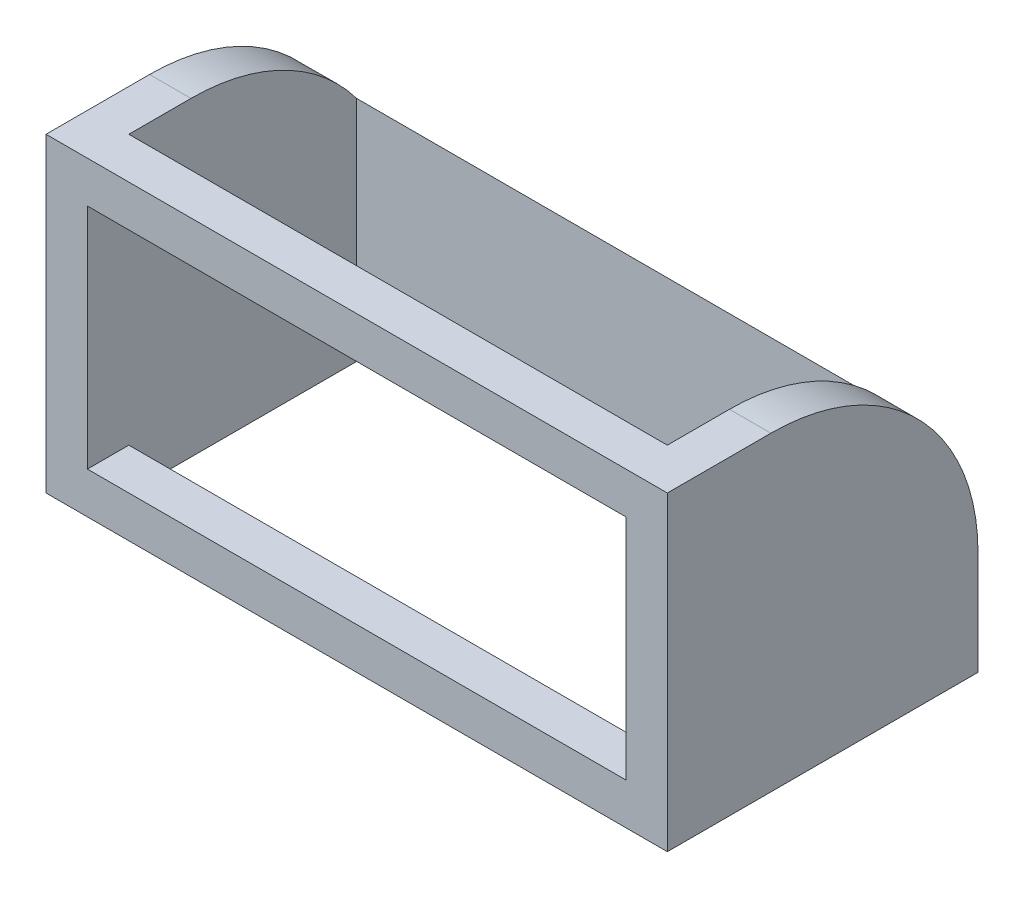
ISO-10303-21;
HEADER;
FILE_DESCRIPTION(('STEP AP214'),'2;1');
FILE_NAME('part.step','',(''),(''),'','','');
FILE_SCHEMA(('AUTOMOTIVE_DESIGN { 1 0 10303 214 1 1 1 1 }'));
ENDSEC;
DATA;
#1=APPLICATION_CONTEXT('core data for automotive mechanical design processes');
#2=APPLICATION_PROTOCOL_DEFINITION('international standard','automotive_design',2000,#1);
#3=PRODUCT_CONTEXT('',#1,'mechanical');
#4=PRODUCT('Part','Part','',(#3));
#5=PRODUCT_RELATED_PRODUCT_CATEGORY('part','',(#4));
#6=PRODUCT_DEFINITION_FORMATION('','',#4);
#7=PRODUCT_DEFINITION_CONTEXT('part definition',#1,'design');
#8=PRODUCT_DEFINITION('design','',#6,#7);
#9=PRODUCT_DEFINITION_SHAPE('','',#8);
#10=(LENGTH_UNIT() NAMED_UNIT(*) SI_UNIT(.MILLI.,.METRE.));
#11=(NAMED_UNIT(*) PLANE_ANGLE_UNIT() SI_UNIT($,.RADIAN.));
#12=(NAMED_UNIT(*) SI_UNIT($,.STERADIAN.) SOLID_ANGLE_UNIT());
#13=UNCERTAINTY_MEASURE_WITH_UNIT(LENGTH_MEASURE(1.E-05),#10,'distance_accuracy_value','');
#14=(GEOMETRIC_REPRESENTATION_CONTEXT(3) GLOBAL_UNCERTAINTY_ASSIGNED_CONTEXT((#13)) GLOBAL_UNIT_ASSIGNED_CONTEXT((#10,
#11,#12)) REPRESENTATION_CONTEXT('',''));
#15=CARTESIAN_POINT('',(0.,0.,0.));
#16=DIRECTION('',(0.,0.,1.));
#17=DIRECTION('',(1.,0.,0.));
#18=AXIS2_PLACEMENT_3D('',#15,#16,#17);
#19=CARTESIAN_POINT('',(13.,15.,5.5));
#20=DIRECTION('',(0.,0.,1.));
#21=DIRECTION('',(1.,0.,0.));
#22=AXIS2_PLACEMENT_3D('',#19,#20,#21);
#23=PLANE('',#22);
#24=DIRECTION('',(0.,-1.,0.));
#25=VECTOR('',#24,1.);
#26=CARTESIAN_POINT('',(13.,15.,5.5));
#27=LINE('',#26,#25);
#28=CARTESIAN_POINT('',(13.,15.,5.5));
#29=VERTEX_POINT('',#28);
#30=CARTESIAN_POINT('',(13.,13.,5.5));
#31=VERTEX_POINT('',#30);
#32=EDGE_CURVE('E202',#29,#31,#27,.T.);
#33=ORIENTED_EDGE('',*,*,#32,.T.);
#34=DIRECTION('',(-1.,0.,0.));
#35=VECTOR('',#34,1.);
#36=CARTESIAN_POINT('',(13.,13.,5.5));
#37=LINE('',#36,#35);
#38=CARTESIAN_POINT('',(-13.,13.,5.5));
#39=VERTEX_POINT('',#38);
#40=EDGE_CURVE('E11',#31,#39,#37,.T.);
#41=ORIENTED_EDGE('',*,*,#40,.T.);
#42=DIRECTION('',(0.,-1.,0.));
#43=VECTOR('',#42,1.);
#44=CARTESIAN_POINT('',(-13.,15.,5.49999999999999));
#45=LINE('',#44,#43);
#46=CARTESIAN_POINT('',(-13.,15.,5.49999999999999));
#47=VERTEX_POINT('',#46);
#48=EDGE_CURVE('E197',#47,#39,#45,.T.);
#49=ORIENTED_EDGE('',*,*,#48,.F.);
#50=DIRECTION('',(-1.,0.,0.));
#51=VECTOR('',#50,1.);
#52=CARTESIAN_POINT('',(13.,15.,5.5));
#53=LINE('',#52,#51);
#54=EDGE_CURVE('E180',#29,#47,#53,.T.);
#55=ORIENTED_EDGE('',*,*,#54,.F.);
#56=EDGE_LOOP('',(#33,#41,#49,#55));
#57=FACE_BOUND('',#56,.T.);
#58=ADVANCED_FACE('F39',(#57),#23,.F.);
#59=CARTESIAN_POINT('',(15.,15.,7.5));
#60=DIRECTION('',(-1.,0.,0.));
#61=DIRECTION('',(0.,0.,1.));
#62=AXIS2_PLACEMENT_3D('',#59,#60,#61);
#63=PLANE('',#62);
#64=DIRECTION('',(0.,-1.,0.));
#65=VECTOR('',#64,1.);
#66=CARTESIAN_POINT('',(15.,15.,-7.5));
#67=LINE('',#66,#65);
#68=CARTESIAN_POINT('',(15.,5.,-7.5));
#69=VERTEX_POINT('',#68);
#70=CARTESIAN_POINT('',(15.,0.,-7.5));
#71=VERTEX_POINT('',#70);
#72=EDGE_CURVE('E249',#69,#71,#67,.T.);
#73=ORIENTED_EDGE('',*,*,#72,.F.);
#74=CARTESIAN_POINT('',(15.,5.,2.5));
#75=DIRECTION('',(-1.,0.,0.));
#76=DIRECTION('',(0.,0.,1.));
#77=AXIS2_PLACEMENT_3D('',#74,#75,#76);
#78=CIRCLE('',#77,10.);
#79=CARTESIAN_POINT('',(15.,15.,2.5));
#80=VERTEX_POINT('',#79);
#81=EDGE_CURVE('E263',#69,#80,#78,.F.);
#82=ORIENTED_EDGE('',*,*,#81,.T.);
#83=DIRECTION('',(0.,0.,-1.));
#84=VECTOR('',#83,1.);
#85=CARTESIAN_POINT('',(15.,15.,7.5));
#86=LINE('',#85,#84);
#87=CARTESIAN_POINT('',(15.,15.,7.5));
#88=VERTEX_POINT('',#87);
#89=EDGE_CURVE('E215',#88,#80,#86,.T.);
#90=ORIENTED_EDGE('',*,*,#89,.F.);
#91=DIRECTION('',(0.,-1.,0.));
#92=VECTOR('',#91,1.);
#93=CARTESIAN_POINT('',(15.,15.,7.5));
#94=LINE('',#93,#92);
#95=CARTESIAN_POINT('',(15.,0.,7.5));
#96=VERTEX_POINT('',#95);
#97=EDGE_CURVE('E226',#88,#96,#94,.T.);
#98=ORIENTED_EDGE('',*,*,#97,.T.);
#99=DIRECTION('',(0.,0.,-1.));
#100=VECTOR('',#99,1.);
#101=CARTESIAN_POINT('',(15.,0.,7.5));
#102=LINE('',#101,#100);
#103=EDGE_CURVE('E214',#96,#71,#102,.T.);
#104=ORIENTED_EDGE('',*,*,#103,.T.);
#105=EDGE_LOOP('',(#73,#82,#90,#98,#104));
#106=FACE_BOUND('',#105,.T.);
#107=ADVANCED_FACE('F308',(#106),#63,.F.);
#108=CARTESIAN_POINT('',(-15.,15.,-7.5));
#109=DIRECTION('',(0.,0.,1.));
#110=DIRECTION('',(1.,0.,0.));
#111=AXIS2_PLACEMENT_3D('',#108,#109,#110);
#112=PLANE('',#111);
#113=DIRECTION('',(0.,-1.,0.));
#114=VECTOR('',#113,1.);
#115=CARTESIAN_POINT('',(-15.,15.,-7.5));
#116=LINE('',#115,#114);
#117=CARTESIAN_POINT('',(-15.,5.,-7.5));
#118=VERTEX_POINT('',#117);
#119=CARTESIAN_POINT('',(-15.,0.,-7.5));
#120=VERTEX_POINT('',#119);
#121=EDGE_CURVE('E246',#118,#120,#116,.T.);
#122=ORIENTED_EDGE('',*,*,#121,.F.);
#123=DIRECTION('',(-1.,0.,0.));
#124=VECTOR('',#123,1.);
#125=CARTESIAN_POINT('',(-15.,5.,-7.5));
#126=LINE('',#125,#124);
#127=EDGE_CURVE('E260',#118,#69,#126,.F.);
#128=ORIENTED_EDGE('',*,*,#127,.T.);
#129=ORIENTED_EDGE('',*,*,#72,.T.);
#130=DIRECTION('',(-1.,0.,0.));
#131=VECTOR('',#130,1.);
#132=CARTESIAN_POINT('',(-15.,0.,-7.5));
#133=LINE('',#132,#131);
#134=EDGE_CURVE('E230',#71,#120,#133,.T.);
#135=ORIENTED_EDGE('',*,*,#134,.T.);
#136=EDGE_LOOP('',(#122,#128,#129,#135));
#137=FACE_BOUND('',#136,.T.);
#138=ADVANCED_FACE('F316',(#137),#112,.F.);
#139=CARTESIAN_POINT('',(-15.,15.,7.5));
#140=DIRECTION('',(1.,0.,0.));
#141=DIRECTION('',(0.,0.,-1.));
#142=AXIS2_PLACEMENT_3D('',#139,#140,#141);
#143=PLANE('',#142);
#144=DIRECTION('',(0.,0.,1.));
#145=VECTOR('',#144,1.);
#146=CARTESIAN_POINT('',(-15.,15.,7.5));
#147=LINE('',#146,#145);
#148=CARTESIAN_POINT('',(-15.,15.,2.5));
#149=VERTEX_POINT('',#148);
#150=CARTESIAN_POINT('',(-15.,15.,7.5));
#151=VERTEX_POINT('',#150);
#152=EDGE_CURVE('E219',#149,#151,#147,.T.);
#153=ORIENTED_EDGE('',*,*,#152,.F.);
#154=CARTESIAN_POINT('',(-15.,5.,2.5));
#155=DIRECTION('',(1.,0.,0.));
#156=DIRECTION('',(0.,0.,-1.));
#157=AXIS2_PLACEMENT_3D('',#154,#155,#156);
#158=CIRCLE('',#157,10.);
#159=EDGE_CURVE('E257',#149,#118,#158,.F.);
#160=ORIENTED_EDGE('',*,*,#159,.T.);
#161=ORIENTED_EDGE('',*,*,#121,.T.);
#162=DIRECTION('',(0.,0.,1.));
#163=VECTOR('',#162,1.);
#164=CARTESIAN_POINT('',(-15.,0.,7.5));
#165=LINE('',#164,#163);
#166=CARTESIAN_POINT('',(-15.,0.,7.5));
#167=VERTEX_POINT('',#166);
#168=EDGE_CURVE('E234',#120,#167,#165,.T.);
#169=ORIENTED_EDGE('',*,*,#168,.T.);
#170=DIRECTION('',(0.,-1.,0.));
#171=VECTOR('',#170,1.);
#172=CARTESIAN_POINT('',(-15.,15.,7.5));
#173=LINE('',#172,#171);
#174=EDGE_CURVE('E242',#151,#167,#173,.T.);
#175=ORIENTED_EDGE('',*,*,#174,.F.);
#176=EDGE_LOOP('',(#153,#160,#161,#169,#175));
#177=FACE_BOUND('',#176,.T.);
#178=ADVANCED_FACE('F320',(#177),#143,.F.);
#179=CARTESIAN_POINT('',(-15.,15.,7.5));
#180=DIRECTION('',(0.,0.,-1.));
#181=DIRECTION('',(-1.,0.,0.));
#182=AXIS2_PLACEMENT_3D('',#179,#180,#181);
#183=PLANE('',#182);
#184=DIRECTION('',(1.,0.,0.));
#185=VECTOR('',#184,1.);
#186=CARTESIAN_POINT('',(-13.,2.,7.5));
#187=LINE('',#186,#185);
#188=CARTESIAN_POINT('',(-13.,2.,7.5));
#189=VERTEX_POINT('',#188);
#190=CARTESIAN_POINT('',(13.,2.,7.5));
#191=VERTEX_POINT('',#190);
#192=EDGE_CURVE('E154',#189,#191,#187,.T.);
#193=ORIENTED_EDGE('',*,*,#192,.F.);
#194=DIRECTION('',(0.,-1.,0.));
#195=VECTOR('',#194,1.);
#196=CARTESIAN_POINT('',(-13.,2.,7.5));
#197=LINE('',#196,#195);
#198=CARTESIAN_POINT('',(-13.,13.,7.5));
#199=VERTEX_POINT('',#198);
#200=EDGE_CURVE('E55',#199,#189,#197,.T.);
#201=ORIENTED_EDGE('',*,*,#200,.F.);
#202=DIRECTION('',(-1.,0.,0.));
#203=VECTOR('',#202,1.);
#204=CARTESIAN_POINT('',(-13.,13.,7.5));
#205=LINE('',#204,#203);
#206=CARTESIAN_POINT('',(13.,13.,7.5));
#207=VERTEX_POINT('',#206);
#208=EDGE_CURVE('E162',#207,#199,#205,.T.);
#209=ORIENTED_EDGE('',*,*,#208,.F.);
#210=DIRECTION('',(0.,1.,0.));
#211=VECTOR('',#210,1.);
#212=CARTESIAN_POINT('',(13.,2.,7.5));
#213=LINE('',#212,#211);
#214=EDGE_CURVE('E145',#191,#207,#213,.T.);
#215=ORIENTED_EDGE('',*,*,#214,.F.);
#216=EDGE_LOOP('',(#193,#201,#209,#215));
#217=FACE_BOUND('',#216,.T.);
#218=DIRECTION('',(1.,0.,0.));
#219=VECTOR('',#218,1.);
#220=CARTESIAN_POINT('',(-15.,0.,7.5));
#221=LINE('',#220,#219);
#222=EDGE_CURVE('E220',#167,#96,#221,.T.);
#223=ORIENTED_EDGE('',*,*,#222,.T.);
#224=ORIENTED_EDGE('',*,*,#97,.F.);
#225=DIRECTION('',(1.,0.,0.));
#226=VECTOR('',#225,1.);
#227=CARTESIAN_POINT('',(-15.,15.,7.5));
#228=LINE('',#227,#226);
#229=EDGE_CURVE('E223',#151,#88,#228,.T.);
#230=ORIENTED_EDGE('',*,*,#229,.F.);
#231=ORIENTED_EDGE('',*,*,#174,.T.);
#232=EDGE_LOOP('',(#223,#224,#230,#231));
#233=FACE_BOUND('',#232,.T.);
#234=ADVANCED_FACE('F159',(#217,#233),#183,.F.);
#235=CARTESIAN_POINT('',(0.,15.,0.));
#236=DIRECTION('',(0.,-1.,0.));
#237=DIRECTION('',(0.,0.,-1.));
#238=AXIS2_PLACEMENT_3D('',#235,#236,#237);
#239=PLANE('',#238);
#240=DIRECTION('',(-1.,0.,0.));
#241=VECTOR('',#240,1.);
#242=CARTESIAN_POINT('',(0.,15.,2.5));
#243=LINE('',#242,#241);
#244=CARTESIAN_POINT('',(13.,15.,2.5));
#245=VERTEX_POINT('',#244);
#246=EDGE_CURVE('E253',#80,#245,#243,.T.);
#247=ORIENTED_EDGE('',*,*,#246,.T.);
#248=DIRECTION('',(0.,0.,1.));
#249=VECTOR('',#248,1.);
#250=CARTESIAN_POINT('',(13.,15.,-5.5));
#251=LINE('',#250,#249);
#252=EDGE_CURVE('E172',#245,#29,#251,.T.);
#253=ORIENTED_EDGE('',*,*,#252,.T.);
#254=ORIENTED_EDGE('',*,*,#54,.T.);
#255=DIRECTION('',(0.,0.,-1.));
#256=VECTOR('',#255,1.);
#257=CARTESIAN_POINT('',(-13.,15.,-5.50000000000001));
#258=LINE('',#257,#256);
#259=CARTESIAN_POINT('',(-13.,15.,2.5));
#260=VERTEX_POINT('',#259);
#261=EDGE_CURVE('E184',#47,#260,#258,.T.);
#262=ORIENTED_EDGE('',*,*,#261,.T.);
#263=EDGE_CURVE('E252',#260,#149,#243,.T.);
#264=ORIENTED_EDGE('',*,*,#263,.T.);
#265=ORIENTED_EDGE('',*,*,#152,.T.);
#266=ORIENTED_EDGE('',*,*,#229,.T.);
#267=ORIENTED_EDGE('',*,*,#89,.T.);
#268=EDGE_LOOP('',(#247,#253,#254,#262,#264,#265,#266,#267));
#269=FACE_BOUND('',#268,.T.);
#270=ADVANCED_FACE('F302',(#269),#239,.F.);
#271=CARTESIAN_POINT('',(0.,0.,0.));
#272=DIRECTION('',(0.,-1.,0.));
#273=DIRECTION('',(0.,0.,-1.));
#274=AXIS2_PLACEMENT_3D('',#271,#272,#273);
#275=PLANE('',#274);
#276=DIRECTION('',(0.,0.,1.));
#277=VECTOR('',#276,1.);
#278=CARTESIAN_POINT('',(13.,0.,0.));
#279=LINE('',#278,#277);
#280=CARTESIAN_POINT('',(13.,0.,-5.5));
#281=VERTEX_POINT('',#280);
#282=CARTESIAN_POINT('',(13.,0.,5.5));
#283=VERTEX_POINT('',#282);
#284=EDGE_CURVE('E211',#281,#283,#279,.T.);
#285=ORIENTED_EDGE('',*,*,#284,.F.);
#286=DIRECTION('',(1.,0.,0.));
#287=VECTOR('',#286,1.);
#288=CARTESIAN_POINT('',(0.,0.,-5.5));
#289=LINE('',#288,#287);
#290=CARTESIAN_POINT('',(-13.,0.,-5.50000000000001));
#291=VERTEX_POINT('',#290);
#292=EDGE_CURVE('E208',#291,#281,#289,.T.);
#293=ORIENTED_EDGE('',*,*,#292,.F.);
#294=DIRECTION('',(0.,0.,-1.));
#295=VECTOR('',#294,1.);
#296=CARTESIAN_POINT('',(-13.,0.,0.));
#297=LINE('',#296,#295);
#298=CARTESIAN_POINT('',(-13.,0.,5.49999999999999));
#299=VERTEX_POINT('',#298);
#300=EDGE_CURVE('E192',#299,#291,#297,.T.);
#301=ORIENTED_EDGE('',*,*,#300,.F.);
#302=DIRECTION('',(-1.,0.,0.));
#303=VECTOR('',#302,1.);
#304=CARTESIAN_POINT('',(0.,0.,5.5));
#305=LINE('',#304,#303);
#306=EDGE_CURVE('E276',#283,#299,#305,.T.);
#307=ORIENTED_EDGE('',*,*,#306,.F.);
#308=EDGE_LOOP('',(#285,#293,#301,#307));
#309=FACE_BOUND('',#308,.T.);
#310=ORIENTED_EDGE('',*,*,#103,.F.);
#311=ORIENTED_EDGE('',*,*,#222,.F.);
#312=ORIENTED_EDGE('',*,*,#168,.F.);
#313=ORIENTED_EDGE('',*,*,#134,.F.);
#314=EDGE_LOOP('',(#310,#311,#312,#313));
#315=FACE_BOUND('',#314,.T.);
#316=ADVANCED_FACE('F290',(#309,#315),#275,.T.);
#317=CARTESIAN_POINT('',(0.,5.,2.5));
#318=DIRECTION('',(-1.,0.,0.));
#319=DIRECTION('',(0.,0.,1.));
#320=AXIS2_PLACEMENT_3D('',#317,#318,#319);
#321=CYLINDRICAL_SURFACE('',#320,10.);
#322=CARTESIAN_POINT('',(13.,5.,2.5));
#323=DIRECTION('',(1.,0.,0.));
#324=DIRECTION('',(0.,0.,-1.));
#325=AXIS2_PLACEMENT_3D('',#322,#323,#324);
#326=CIRCLE('',#325,10.);
#327=CARTESIAN_POINT('',(13.,11.,-5.5));
#328=VERTEX_POINT('',#327);
#329=EDGE_CURVE('E273',#245,#328,#326,.F.);
#330=ORIENTED_EDGE('',*,*,#329,.F.);
#331=ORIENTED_EDGE('',*,*,#246,.F.);
#332=ORIENTED_EDGE('',*,*,#81,.F.);
#333=ORIENTED_EDGE('',*,*,#127,.F.);
#334=ORIENTED_EDGE('',*,*,#159,.F.);
#335=ORIENTED_EDGE('',*,*,#263,.F.);
#336=CARTESIAN_POINT('',(-13.,5.,2.5));
#337=DIRECTION('',(-1.,0.,0.));
#338=DIRECTION('',(0.,0.,1.));
#339=AXIS2_PLACEMENT_3D('',#336,#337,#338);
#340=CIRCLE('',#339,10.);
#341=CARTESIAN_POINT('',(-13.,11.,-5.50000000000001));
#342=VERTEX_POINT('',#341);
#343=EDGE_CURVE('E266',#342,#260,#340,.F.);
#344=ORIENTED_EDGE('',*,*,#343,.F.);
#345=DIRECTION('',(-1.,0.,0.));
#346=VECTOR('',#345,1.);
#347=CARTESIAN_POINT('',(0.,11.,-5.5));
#348=LINE('',#347,#346);
#349=EDGE_CURVE('E269',#328,#342,#348,.T.);
#350=ORIENTED_EDGE('',*,*,#349,.F.);
#351=EDGE_LOOP('',(#330,#331,#332,#333,#334,#335,#344,#350));
#352=FACE_BOUND('',#351,.T.);
#353=ADVANCED_FACE('F41',(#352),#321,.T.);
#354=CARTESIAN_POINT('',(13.,15.,-5.5));
#355=DIRECTION('',(1.,0.,0.));
#356=DIRECTION('',(0.,0.,-1.));
#357=AXIS2_PLACEMENT_3D('',#354,#355,#356);
#358=PLANE('',#357);
#359=DIRECTION('',(0.,0.,1.));
#360=VECTOR('',#359,1.);
#361=CARTESIAN_POINT('',(13.,13.,-2.5));
#362=LINE('',#361,#360);
#363=EDGE_CURVE('E150',#31,#207,#362,.T.);
#364=ORIENTED_EDGE('',*,*,#363,.F.);
#365=ORIENTED_EDGE('',*,*,#32,.F.);
#366=ORIENTED_EDGE('',*,*,#252,.F.);
#367=ORIENTED_EDGE('',*,*,#329,.T.);
#368=DIRECTION('',(0.,-1.,0.));
#369=VECTOR('',#368,1.);
#370=CARTESIAN_POINT('',(13.,15.,-5.5));
#371=LINE('',#370,#369);
#372=EDGE_CURVE('E188',#328,#281,#371,.T.);
#373=ORIENTED_EDGE('',*,*,#372,.T.);
#374=ORIENTED_EDGE('',*,*,#284,.T.);
#375=CARTESIAN_POINT('',(13.,2.,5.5));
#376=VERTEX_POINT('',#375);
#377=EDGE_CURVE('E148',#376,#283,#27,.T.);
#378=ORIENTED_EDGE('',*,*,#377,.F.);
#379=DIRECTION('',(0.,0.,1.));
#380=VECTOR('',#379,1.);
#381=CARTESIAN_POINT('',(13.,2.,-2.5));
#382=LINE('',#381,#380);
#383=EDGE_CURVE('E63',#376,#191,#382,.T.);
#384=ORIENTED_EDGE('',*,*,#383,.T.);
#385=ORIENTED_EDGE('',*,*,#214,.T.);
#386=EDGE_LOOP('',(#364,#365,#366,#367,#373,#374,#378,#384,#385));
#387=FACE_BOUND('',#386,.T.);
#388=ADVANCED_FACE('F143',(#387),#358,.F.);
#389=CARTESIAN_POINT('',(13.,15.,-5.5));
#390=DIRECTION('',(0.,0.,-1.));
#391=DIRECTION('',(-1.,0.,0.));
#392=AXIS2_PLACEMENT_3D('',#389,#390,#391);
#393=PLANE('',#392);
#394=ORIENTED_EDGE('',*,*,#292,.T.);
#395=ORIENTED_EDGE('',*,*,#372,.F.);
#396=ORIENTED_EDGE('',*,*,#349,.T.);
#397=DIRECTION('',(0.,-1.,0.));
#398=VECTOR('',#397,1.);
#399=CARTESIAN_POINT('',(-13.,15.,-5.50000000000001));
#400=LINE('',#399,#398);
#401=EDGE_CURVE('E193',#342,#291,#400,.T.);
#402=ORIENTED_EDGE('',*,*,#401,.T.);
#403=EDGE_LOOP('',(#394,#395,#396,#402));
#404=FACE_BOUND('',#403,.T.);
#405=ADVANCED_FACE('F294',(#404),#393,.F.);
#406=CARTESIAN_POINT('',(-13.,15.,-5.50000000000001));
#407=DIRECTION('',(-1.,0.,0.));
#408=DIRECTION('',(0.,0.,1.));
#409=AXIS2_PLACEMENT_3D('',#406,#407,#408);
#410=PLANE('',#409);
#411=DIRECTION('',(0.,0.,1.));
#412=VECTOR('',#411,1.);
#413=CARTESIAN_POINT('',(-13.,2.,-2.5));
#414=LINE('',#413,#412);
#415=CARTESIAN_POINT('',(-13.,2.,5.5));
#416=VERTEX_POINT('',#415);
#417=EDGE_CURVE('E151',#416,#189,#414,.T.);
#418=ORIENTED_EDGE('',*,*,#417,.F.);
#419=EDGE_CURVE('E201',#416,#299,#45,.T.);
#420=ORIENTED_EDGE('',*,*,#419,.T.);
#421=ORIENTED_EDGE('',*,*,#300,.T.);
#422=ORIENTED_EDGE('',*,*,#401,.F.);
#423=ORIENTED_EDGE('',*,*,#343,.T.);
#424=ORIENTED_EDGE('',*,*,#261,.F.);
#425=ORIENTED_EDGE('',*,*,#48,.T.);
#426=DIRECTION('',(0.,0.,1.));
#427=VECTOR('',#426,1.);
#428=CARTESIAN_POINT('',(-13.,13.,-2.5));
#429=LINE('',#428,#427);
#430=EDGE_CURVE('E169',#39,#199,#429,.T.);
#431=ORIENTED_EDGE('',*,*,#430,.T.);
#432=ORIENTED_EDGE('',*,*,#200,.T.);
#433=EDGE_LOOP('',(#418,#420,#421,#422,#423,#424,#425,#431,#432));
#434=FACE_BOUND('',#433,.T.);
#435=ADVANCED_FACE('F283',(#434),#410,.F.);
#436=ORIENTED_EDGE('',*,*,#419,.F.);
#437=DIRECTION('',(1.,0.,0.));
#438=VECTOR('',#437,1.);
#439=CARTESIAN_POINT('',(13.,2.,5.5));
#440=LINE('',#439,#438);
#441=EDGE_CURVE('E48',#416,#376,#440,.T.);
#442=ORIENTED_EDGE('',*,*,#441,.T.);
#443=ORIENTED_EDGE('',*,*,#377,.T.);
#444=ORIENTED_EDGE('',*,*,#306,.T.);
#445=EDGE_LOOP('',(#436,#442,#443,#444));
#446=FACE_BOUND('',#445,.T.);
#447=ADVANCED_FACE('F282',(#446),#23,.F.);
#448=CARTESIAN_POINT('',(-13.,13.,-2.5));
#449=DIRECTION('',(0.,1.,0.));
#450=DIRECTION('',(0.,0.,1.));
#451=AXIS2_PLACEMENT_3D('',#448,#449,#450);
#452=PLANE('',#451);
#453=ORIENTED_EDGE('',*,*,#363,.T.);
#454=ORIENTED_EDGE('',*,*,#208,.T.);
#455=ORIENTED_EDGE('',*,*,#430,.F.);
#456=ORIENTED_EDGE('',*,*,#40,.F.);
#457=EDGE_LOOP('',(#453,#454,#455,#456));
#458=FACE_BOUND('',#457,.T.);
#459=ADVANCED_FACE('F328',(#458),#452,.F.);
#460=CARTESIAN_POINT('',(-13.,2.,-2.5));
#461=DIRECTION('',(0.,-1.,0.));
#462=DIRECTION('',(0.,0.,-1.));
#463=AXIS2_PLACEMENT_3D('',#460,#461,#462);
#464=PLANE('',#463);
#465=ORIENTED_EDGE('',*,*,#417,.T.);
#466=ORIENTED_EDGE('',*,*,#192,.T.);
#467=ORIENTED_EDGE('',*,*,#383,.F.);
#468=ORIENTED_EDGE('',*,*,#441,.F.);
#469=EDGE_LOOP('',(#465,#466,#467,#468));
#470=FACE_BOUND('',#469,.T.);
#471=ADVANCED_FACE('F155',(#470),#464,.F.);
#472=CLOSED_SHELL('',(#58,#107,#138,#178,#234,#270,#316,#353,#388,#405,#435,#447,#459,#471));
#473=MANIFOLD_SOLID_BREP('B2',#472);
#474=ADVANCED_BREP_SHAPE_REPRESENTATION('',(#18,#473),#14);
#475=SHAPE_DEFINITION_REPRESENTATION(#9,#474);
ENDSEC;
END-ISO-10303-21;
